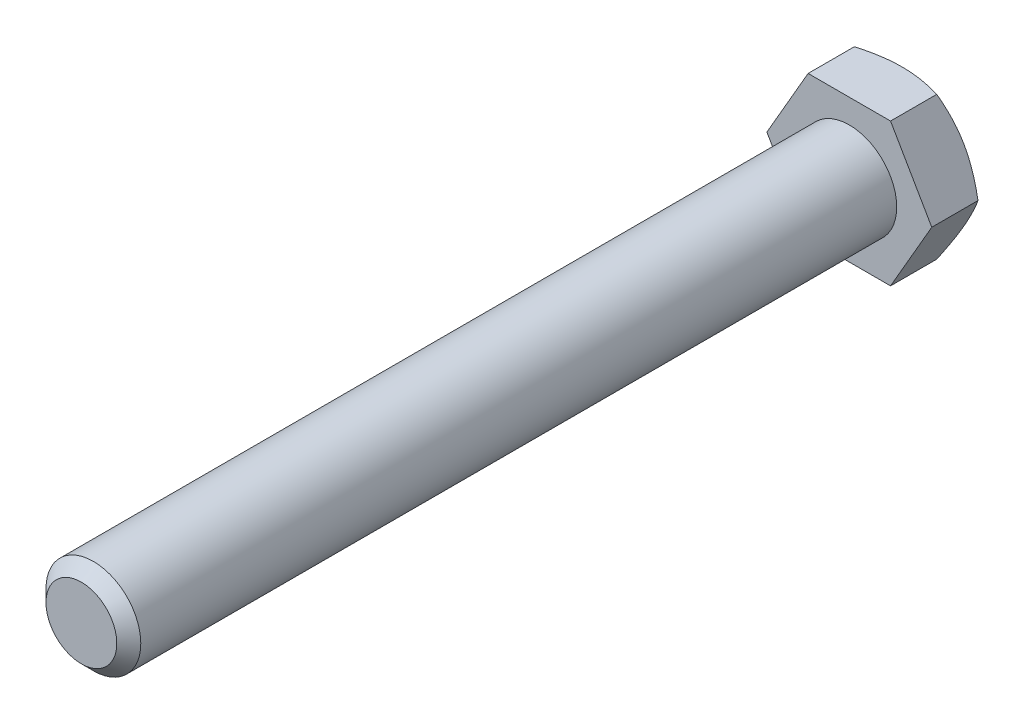
ISO-10303-21;
HEADER;
FILE_DESCRIPTION(('STEP AP214'),'2;1');
FILE_NAME('part.step','',(''),(''),'','','');
FILE_SCHEMA(('AUTOMOTIVE_DESIGN { 1 0 10303 214 1 1 1 1 }'));
ENDSEC;
DATA;
#1=APPLICATION_CONTEXT('core data for automotive mechanical design processes');
#2=APPLICATION_PROTOCOL_DEFINITION('international standard','automotive_design',2000,#1);
#3=PRODUCT_CONTEXT('',#1,'mechanical');
#4=PRODUCT('Part','Part','',(#3));
#5=PRODUCT_RELATED_PRODUCT_CATEGORY('part','',(#4));
#6=PRODUCT_DEFINITION_FORMATION('','',#4);
#7=PRODUCT_DEFINITION_CONTEXT('part definition',#1,'design');
#8=PRODUCT_DEFINITION('design','',#6,#7);
#9=PRODUCT_DEFINITION_SHAPE('','',#8);
#10=(LENGTH_UNIT() NAMED_UNIT(*) SI_UNIT(.MILLI.,.METRE.));
#11=(NAMED_UNIT(*) PLANE_ANGLE_UNIT() SI_UNIT($,.RADIAN.));
#12=(NAMED_UNIT(*) SI_UNIT($,.STERADIAN.) SOLID_ANGLE_UNIT());
#13=UNCERTAINTY_MEASURE_WITH_UNIT(LENGTH_MEASURE(1.E-05),#10,'distance_accuracy_value','');
#14=(GEOMETRIC_REPRESENTATION_CONTEXT(3) GLOBAL_UNCERTAINTY_ASSIGNED_CONTEXT((#13)) GLOBAL_UNIT_ASSIGNED_CONTEXT((#10,
#11,#12)) REPRESENTATION_CONTEXT('',''));
#15=CARTESIAN_POINT('',(0.,0.,0.));
#16=DIRECTION('',(0.,0.,1.));
#17=DIRECTION('',(1.,0.,0.));
#18=AXIS2_PLACEMENT_3D('',#15,#16,#17);
#19=CARTESIAN_POINT('',(-6.87046820335655,0.,0.));
#20=DIRECTION('',(0.,0.,1.));
#21=DIRECTION('',(1.,0.,0.));
#22=AXIS2_PLACEMENT_3D('',#19,#20,#21);
#23=PLANE('',#22);
#24=CARTESIAN_POINT('',(0.,0.,0.));
#25=DIRECTION('',(0.,0.,1.));
#26=DIRECTION('',(1.,0.,0.));
#27=AXIS2_PLACEMENT_3D('',#24,#25,#26);
#28=CIRCLE('',#27,5.75000000000001);
#29=CARTESIAN_POINT('',(5.75000000000001,0.,0.));
#30=VERTEX_POINT('',#29);
#31=EDGE_CURVE('E21',#30,#30,#28,.T.);
#32=ORIENTED_EDGE('',*,*,#31,.F.);
#33=EDGE_LOOP('',(#32));
#34=FACE_BOUND('',#33,.T.);
#35=ADVANCED_FACE('F18',(#34),#23,.F.);
#36=CARTESIAN_POINT('',(0.,0.,0.650784034539269));
#37=DIRECTION('',(0.,0.,1.));
#38=DIRECTION('',(1.,0.,0.));
#39=AXIS2_PLACEMENT_3D('',#36,#37,#38);
#40=CONICAL_SURFACE('',#39,6.8771910125767,1.0471975511966);
#41=ORIENTED_EDGE('',*,*,#31,.T.);
#42=EDGE_LOOP('',(#41));
#43=FACE_BOUND('',#42,.T.);
#44=CARTESIAN_POINT('',(-6.87046820335654,0.,0.646902618826299));
#45=CARTESIAN_POINT('',(-6.79495870568168,0.130786286426872,0.603315600492732));
#46=CARTESIAN_POINT('',(-6.71916767305091,0.262060205701468,0.561706886634503));
#47=CARTESIAN_POINT('',(-6.5669701138254,0.525674111068019,0.482990907622878));
#48=CARTESIAN_POINT('',(-6.49056333675953,0.658014530988701,0.445885584322402));
#49=CARTESIAN_POINT('',(-6.26011972368761,1.05715457710901,0.342053088782598));
#50=CARTESIAN_POINT('',(-6.10517327768795,1.32552969403265,0.282995277439475));
#51=CARTESIAN_POINT('',(-5.87329875913655,1.72714814114424,0.213744692153124));
#52=CARTESIAN_POINT('',(-5.79706343562102,1.85919159480459,0.194017533469075));
#53=CARTESIAN_POINT('',(-5.64424836941167,2.12387505364119,0.160938763141249));
#54=CARTESIAN_POINT('',(-5.5676686577517,2.25651500506524,0.147586588205554));
#55=CARTESIAN_POINT('',(-5.41437627553456,2.52202519947858,0.127598068405892));
#56=CARTESIAN_POINT('',(-5.33766385524756,2.65489500898724,0.120954102814179));
#57=CARTESIAN_POINT('',(-5.18417244162739,2.92074993590294,0.11451733148269));
#58=CARTESIAN_POINT('',(-5.10739345042496,3.05373504961945,0.114724314011353));
#59=CARTESIAN_POINT('',(-4.89705723311697,3.41804806466872,0.124707706897092));
#60=CARTESIAN_POINT('',(-4.76356889956949,3.64925664059066,0.141458760287246));
#61=CARTESIAN_POINT('',(-4.49747882662404,4.11013816632189,0.194570766058901));
#62=CARTESIAN_POINT('',(-4.36487802263779,4.33980949595056,0.230949862195485));
#63=CARTESIAN_POINT('',(-4.09825268712567,4.80161812364264,0.321884794411527));
#64=CARTESIAN_POINT('',(-3.96426178924513,5.03369716652351,0.376825814429518));
#65=CARTESIAN_POINT('',(-3.69827788307303,5.49439480600922,0.501518898713052));
#66=CARTESIAN_POINT('',(-3.56628146986192,5.72301930010771,0.571241683534182));
#67=CARTESIAN_POINT('',(-3.43523410167826,5.95,0.6469026188263));
#68=B_SPLINE_CURVE_WITH_KNOTS('',3,(#44,#45,#46,#47,#48,#49,#50,#51,#52,#53,#54,#55,#56,#57,#58,
#59,#60,#61,#62,#63,#64,#65,#66,#67),.UNSPECIFIED.,.F.,.F.,(4,2,2,2,2,2,2,2,2,2,2,4),(0.,
0.471512008193405,0.943226614464619,1.88861558573863,2.34973252633164,2.81080871520698,
3.27136051629853,3.73189808384768,4.53356209270655,5.33596841591502,6.15616826628045,
6.97475841058366),.UNSPECIFIED.);
#69=CARTESIAN_POINT('',(-6.87046820335654,0.,0.646902618826301));
#70=VERTEX_POINT('',#69);
#71=CARTESIAN_POINT('',(-3.43523410167826,5.95,0.646902618826301));
#72=VERTEX_POINT('',#71);
#73=EDGE_CURVE('E72',#70,#72,#68,.T.);
#74=ORIENTED_EDGE('',*,*,#73,.T.);
#75=CARTESIAN_POINT('',(3.43523410167829,5.95,0.646902618826309));
#76=CARTESIAN_POINT('',(3.28421510632857,5.95,0.603315600492742));
#77=CARTESIAN_POINT('',(3.13263304106704,5.95,0.561706886634513));
#78=CARTESIAN_POINT('',(2.82823792261602,5.95,0.482990907622887));
#79=CARTESIAN_POINT('',(2.67542436848427,5.95,0.44588558432241));
#80=CARTESIAN_POINT('',(2.21453714234043,5.95,0.342053088782605));
#81=CARTESIAN_POINT('',(1.9046442503411,5.95,0.282995277439482));
#82=CARTESIAN_POINT('',(1.44089521323832,5.95,0.21374469215313));
#83=CARTESIAN_POINT('',(1.28842456620725,5.95,0.194017533469081));
#84=CARTESIAN_POINT('',(0.982794433788545,5.95,0.160938763141255));
#85=CARTESIAN_POINT('',(0.829635010468604,5.95,0.147586588205559));
#86=CARTESIAN_POINT('',(0.523050246034334,5.95,0.127598068405897));
#87=CARTESIAN_POINT('',(0.369625405460339,5.95,0.120954102814184));
#88=CARTESIAN_POINT('',(0.0626425782199958,5.95,0.114517331482695));
#89=CARTESIAN_POINT('',(-0.0909154041848748,5.95,0.114724314011358));
#90=CARTESIAN_POINT('',(-0.511587838800844,5.95,0.124707706897096));
#91=CARTESIAN_POINT('',(-0.778564505895808,5.95,0.14145876028725));
#92=CARTESIAN_POINT('',(-1.3107446517867,5.95,0.194570766058904));
#93=CARTESIAN_POINT('',(-1.57594625975921,5.95,0.230949862195487));
#94=CARTESIAN_POINT('',(-2.10919693078345,5.95,0.321884794411528));
#95=CARTESIAN_POINT('',(-2.37717872654452,5.95,0.37682581442952));
#96=CARTESIAN_POINT('',(-2.90914653888872,5.95,0.501518898713053));
#97=CARTESIAN_POINT('',(-3.17313936531093,5.95,0.571241683534182));
#98=CARTESIAN_POINT('',(-3.43523410167826,5.95,0.6469026188263));
#99=B_SPLINE_CURVE_WITH_KNOTS('',3,(#75,#76,#77,#78,#79,#80,#81,#82,#83,#84,#85,#86,#87,#88,#89,
#90,#91,#92,#93,#94,#95,#96,#97,#98),.UNSPECIFIED.,.F.,.F.,(4,2,2,2,2,2,2,2,2,2,2,4),(0.,
0.471512008193406,0.943226614464622,1.88861558573863,2.34973252633164,2.81080871520699,
3.27136051629854,3.73189808384769,4.53356209270656,5.33596841591503,6.15616826628046,
6.97475841058368),.UNSPECIFIED.);
#100=CARTESIAN_POINT('',(3.43523410167829,5.95,0.646902618826309));
#101=VERTEX_POINT('',#100);
#102=EDGE_CURVE('E132',#101,#72,#99,.T.);
#103=ORIENTED_EDGE('',*,*,#102,.F.);
#104=CARTESIAN_POINT('',(6.87046820335656,0.,0.646902618826314));
#105=CARTESIAN_POINT('',(6.7949587056817,0.130786286426848,0.603315600492747));
#106=CARTESIAN_POINT('',(6.71916767305094,0.262060205701445,0.561706886634518));
#107=CARTESIAN_POINT('',(6.56697011382543,0.525674111067998,0.482990907622892));
#108=CARTESIAN_POINT('',(6.49056333675956,0.65801453098868,0.445885584322415));
#109=CARTESIAN_POINT('',(6.26011972368764,1.05715457710899,0.342053088782611));
#110=CARTESIAN_POINT('',(6.10517327768797,1.32552969403264,0.282995277439488));
#111=CARTESIAN_POINT('',(5.87329875913658,1.72714814114422,0.213744692153136));
#112=CARTESIAN_POINT('',(5.79706343562105,1.85919159480458,0.194017533469086));
#113=CARTESIAN_POINT('',(5.64424836941169,2.12387505364118,0.16093876314126));
#114=CARTESIAN_POINT('',(5.56766865775172,2.25651500506522,0.147586588205565));
#115=CARTESIAN_POINT('',(5.41437627553459,2.52202519947857,0.127598068405903));
#116=CARTESIAN_POINT('',(5.33766385524759,2.65489500898723,0.12095410281419));
#117=CARTESIAN_POINT('',(5.18417244162742,2.92074993590293,0.1145173314827));
#118=CARTESIAN_POINT('',(5.10739345042498,3.05373504961944,0.114724314011364));
#119=CARTESIAN_POINT('',(4.897057233117,3.41804806466871,0.124707706897103));
#120=CARTESIAN_POINT('',(4.76356889956952,3.64925664059066,0.141458760287257));
#121=CARTESIAN_POINT('',(4.49747882662407,4.11013816632188,0.194570766058911));
#122=CARTESIAN_POINT('',(4.36487802263782,4.33980949595055,0.230949862195494));
#123=CARTESIAN_POINT('',(4.0982526871257,4.80161812364264,0.321884794411535));
#124=CARTESIAN_POINT('',(3.96426178924516,5.0336971665235,0.376825814429527));
#125=CARTESIAN_POINT('',(3.69827788307306,5.49439480600922,0.501518898713061));
#126=CARTESIAN_POINT('',(3.56628146986195,5.72301930010771,0.571241683534191));
#127=CARTESIAN_POINT('',(3.43523410167829,5.95,0.646902618826309));
#128=B_SPLINE_CURVE_WITH_KNOTS('',3,(#104,#105,#106,#107,#108,#109,#110,#111,#112,#113,#114,
#115,#116,#117,#118,#119,#120,#121,#122,#123,#124,#125,#126,#127),.UNSPECIFIED.,.F.,.F.,(4,2,2,
2,2,2,2,2,2,2,2,4),(0.,0.471512008193407,0.943226614464624,1.88861558573863,2.34973252633165,
2.81080871520699,3.27136051629854,3.7318980838477,4.53356209270657,5.33596841591504,
6.15616826628047,6.97475841058369),.UNSPECIFIED.);
#129=CARTESIAN_POINT('',(6.87046820335656,0.,0.646902618826312));
#130=VERTEX_POINT('',#129);
#131=EDGE_CURVE('E139',#130,#101,#128,.T.);
#132=ORIENTED_EDGE('',*,*,#131,.F.);
#133=CARTESIAN_POINT('',(3.43523410167828,-5.95000000000001,0.646902618826309));
#134=CARTESIAN_POINT('',(3.51074359935314,-5.81921371357314,0.603315600492742));
#135=CARTESIAN_POINT('',(3.5865346319839,-5.68793979429855,0.561706886634513));
#136=CARTESIAN_POINT('',(3.73873219120941,-5.424325888932,0.482990907622888));
#137=CARTESIAN_POINT('',(3.81513896827529,-5.29198546901131,0.445885584322411));
#138=CARTESIAN_POINT('',(4.04558258134721,-4.892845422891,0.342053088782608));
#139=CARTESIAN_POINT('',(4.20052902734687,-4.62447030596736,0.282995277439486));
#140=CARTESIAN_POINT('',(4.43240354589827,-4.22285185885578,0.213744692153134));
#141=CARTESIAN_POINT('',(4.5086388694138,-4.09080840519542,0.194017533469085));
#142=CARTESIAN_POINT('',(4.66145393562315,-3.82612494635882,0.160938763141259));
#143=CARTESIAN_POINT('',(4.73803364728312,-3.69348499493477,0.147586588205564));
#144=CARTESIAN_POINT('',(4.89132602950026,-3.42797480052143,0.127598068405903));
#145=CARTESIAN_POINT('',(4.96803844978726,-3.29510499101277,0.12095410281419));
#146=CARTESIAN_POINT('',(5.12152986340743,-3.02925006409706,0.114517331482701));
#147=CARTESIAN_POINT('',(5.19830885460986,-2.89626495038056,0.114724314011365));
#148=CARTESIAN_POINT('',(5.40864507191785,-2.53195193533129,0.124707706897104));
#149=CARTESIAN_POINT('',(5.54213340546533,-2.30074335940935,0.141458760287258));
#150=CARTESIAN_POINT('',(5.80822347841078,-1.83986183367813,0.194570766058912));
#151=CARTESIAN_POINT('',(5.94082428239703,-1.61019050404946,0.230949862195496));
#152=CARTESIAN_POINT('',(6.20744961790915,-1.14838187635737,0.321884794411537));
#153=CARTESIAN_POINT('',(6.34144051578969,-0.916302833476506,0.376825814429529));
#154=CARTESIAN_POINT('',(6.60742442196179,-0.455605193990791,0.501518898713062));
#155=CARTESIAN_POINT('',(6.73942083517289,-0.226980699892305,0.571241683534192));
#156=CARTESIAN_POINT('',(6.87046820335656,0.,0.64690261882631));
#157=B_SPLINE_CURVE_WITH_KNOTS('',3,(#133,#134,#135,#136,#137,#138,#139,#140,#141,#142,#143,
#144,#145,#146,#147,#148,#149,#150,#151,#152,#153,#154,#155,#156),.UNSPECIFIED.,.F.,.F.,(4,2,2,
2,2,2,2,2,2,2,2,4),(0.,0.471512008193406,0.943226614464623,1.88861558573863,2.34973252633165,
2.81080871520699,3.27136051629854,3.73189808384769,4.53356209270656,5.33596841591503,
6.15616826628045,6.97475841058367),.UNSPECIFIED.);
#158=CARTESIAN_POINT('',(3.43523410167827,-5.95,0.646902618826306));
#159=VERTEX_POINT('',#158);
#160=EDGE_CURVE('E162',#159,#130,#157,.T.);
#161=ORIENTED_EDGE('',*,*,#160,.F.);
#162=CARTESIAN_POINT('',(-3.43523410167828,-5.95,0.646902618826306));
#163=CARTESIAN_POINT('',(-3.28421510632856,-5.95,0.603315600492739));
#164=CARTESIAN_POINT('',(-3.13263304106703,-5.95,0.56170688663451));
#165=CARTESIAN_POINT('',(-2.82823792261601,-5.95,0.482990907622884));
#166=CARTESIAN_POINT('',(-2.67542436848426,-5.95,0.445885584322408));
#167=CARTESIAN_POINT('',(-2.21453714234042,-5.95,0.342053088782604));
#168=CARTESIAN_POINT('',(-1.9046442503411,-5.95,0.282995277439481));
#169=CARTESIAN_POINT('',(-1.44089521323831,-5.95,0.213744692153129));
#170=CARTESIAN_POINT('',(-1.28842456620724,-5.95,0.19401753346908));
#171=CARTESIAN_POINT('',(-0.982794433788536,-5.95,0.160938763141254));
#172=CARTESIAN_POINT('',(-0.829635010468596,-5.95,0.147586588205559));
#173=CARTESIAN_POINT('',(-0.523050246034326,-5.95,0.127598068405897));
#174=CARTESIAN_POINT('',(-0.369625405460331,-5.95,0.120954102814184));
#175=CARTESIAN_POINT('',(-0.0626425782199882,-5.95,0.114517331482694));
#176=CARTESIAN_POINT('',(0.0909154041848823,-5.95,0.114724314011358));
#177=CARTESIAN_POINT('',(0.511587838800852,-5.95,0.124707706897096));
#178=CARTESIAN_POINT('',(0.778564505895815,-5.95,0.141458760287251));
#179=CARTESIAN_POINT('',(1.31074465178671,-5.95,0.194570766058905));
#180=CARTESIAN_POINT('',(1.57594625975921,-5.95,0.230949862195489));
#181=CARTESIAN_POINT('',(2.10919693078346,-5.95,0.32188479441153));
#182=CARTESIAN_POINT('',(2.37717872654453,-5.95,0.376825814429521));
#183=CARTESIAN_POINT('',(2.90914653888873,-5.95,0.501518898713055));
#184=CARTESIAN_POINT('',(3.17313936531094,-5.95,0.571241683534185));
#185=CARTESIAN_POINT('',(3.43523410167827,-5.95,0.646902618826304));
#186=B_SPLINE_CURVE_WITH_KNOTS('',3,(#162,#163,#164,#165,#166,#167,#168,#169,#170,#171,#172,
#173,#174,#175,#176,#177,#178,#179,#180,#181,#182,#183,#184,#185),.UNSPECIFIED.,.F.,.F.,(4,2,2,
2,2,2,2,2,2,2,2,4),(0.,0.471512008193406,0.943226614464622,1.88861558573863,2.34973252633164,
2.81080871520698,3.27136051629853,3.73189808384769,4.53356209270656,5.33596841591503,
6.15616826628045,6.97475841058367),.UNSPECIFIED.);
#187=CARTESIAN_POINT('',(-3.43523410167828,-5.95,0.646902618826305));
#188=VERTEX_POINT('',#187);
#189=EDGE_CURVE('E75',#188,#159,#186,.T.);
#190=ORIENTED_EDGE('',*,*,#189,.F.);
#191=CARTESIAN_POINT('',(-3.43523410167827,-5.95,0.646902618826303));
#192=CARTESIAN_POINT('',(-3.51074359935313,-5.81921371357313,0.603315600492736));
#193=CARTESIAN_POINT('',(-3.5865346319839,-5.68793979429854,0.561706886634507));
#194=CARTESIAN_POINT('',(-3.73873219120941,-5.42432588893199,0.482990907622882));
#195=CARTESIAN_POINT('',(-3.81513896827528,-5.29198546901131,0.445885584322405));
#196=CARTESIAN_POINT('',(-4.0455825813472,-4.892845422891,0.342053088782601));
#197=CARTESIAN_POINT('',(-4.20052902734686,-4.62447030596735,0.282995277439478));
#198=CARTESIAN_POINT('',(-4.43240354589826,-4.22285185885577,0.213744692153127));
#199=CARTESIAN_POINT('',(-4.50863886941379,-4.09080840519541,0.194017533469078));
#200=CARTESIAN_POINT('',(-4.66145393562314,-3.82612494635881,0.160938763141252));
#201=CARTESIAN_POINT('',(-4.73803364728311,-3.69348499493477,0.147586588205556));
#202=CARTESIAN_POINT('',(-4.89132602950025,-3.42797480052142,0.127598068405894));
#203=CARTESIAN_POINT('',(-4.96803844978724,-3.29510499101276,0.120954102814181));
#204=CARTESIAN_POINT('',(-5.12152986340742,-3.02925006409706,0.114517331482692));
#205=CARTESIAN_POINT('',(-5.19830885460985,-2.89626495038055,0.114724314011355));
#206=CARTESIAN_POINT('',(-5.40864507191784,-2.53195193533128,0.124707706897094));
#207=CARTESIAN_POINT('',(-5.54213340546532,-2.30074335940934,0.141458760287248));
#208=CARTESIAN_POINT('',(-5.80822347841076,-1.83986183367811,0.194570766058902));
#209=CARTESIAN_POINT('',(-5.94082428239702,-1.61019050404944,0.230949862195486));
#210=CARTESIAN_POINT('',(-6.20744961790914,-1.14838187635735,0.321884794411528));
#211=CARTESIAN_POINT('',(-6.34144051578967,-0.916302833476486,0.37682581442952));
#212=CARTESIAN_POINT('',(-6.60742442196178,-0.455605193990769,0.501518898713054));
#213=CARTESIAN_POINT('',(-6.73942083517288,-0.226980699892281,0.571241683534184));
#214=CARTESIAN_POINT('',(-6.87046820335654,0.,0.646902618826302));
#215=B_SPLINE_CURVE_WITH_KNOTS('',3,(#191,#192,#193,#194,#195,#196,#197,#198,#199,#200,#201,
#202,#203,#204,#205,#206,#207,#208,#209,#210,#211,#212,#213,#214),.UNSPECIFIED.,.F.,.F.,(4,2,2,
2,2,2,2,2,2,2,2,4),(0.,0.471512008193404,0.94322661446462,1.88861558573863,2.34973252633164,
2.81080871520698,3.27136051629853,3.73189808384769,4.53356209270656,5.33596841591503,
6.15616826628046,6.97475841058368),.UNSPECIFIED.);
#216=EDGE_CURVE('E69',#188,#70,#215,.T.);
#217=ORIENTED_EDGE('',*,*,#216,.T.);
#218=EDGE_LOOP('',(#74,#103,#132,#161,#190,#217));
#219=FACE_BOUND('',#218,.T.);
#220=ADVANCED_FACE('F71',(#43,#219),#40,.T.);
#221=CARTESIAN_POINT('',(-3.43523410167826,5.95,4.5));
#222=DIRECTION('',(0.866025403784438,-0.500000000000001,0.));
#223=DIRECTION('',(0.500000000000001,0.866025403784438,0.));
#224=AXIS2_PLACEMENT_3D('',#221,#222,#223);
#225=PLANE('',#224);
#226=ORIENTED_EDGE('',*,*,#73,.F.);
#227=DIRECTION('',(0.,0.,1.));
#228=VECTOR('',#227,1.);
#229=CARTESIAN_POINT('',(-6.87046820335654,0.,4.5));
#230=LINE('',#229,#228);
#231=CARTESIAN_POINT('',(-6.87046820335655,0.,4.5));
#232=VERTEX_POINT('',#231);
#233=EDGE_CURVE('E79',#70,#232,#230,.T.);
#234=ORIENTED_EDGE('',*,*,#233,.T.);
#235=DIRECTION('',(-0.500000000000003,-0.866025403784437,0.));
#236=VECTOR('',#235,1.);
#237=CARTESIAN_POINT('',(-3.43523410167826,5.95,4.5));
#238=LINE('',#237,#236);
#239=CARTESIAN_POINT('',(-3.43523410167826,5.95,4.5));
#240=VERTEX_POINT('',#239);
#241=EDGE_CURVE('E112',#240,#232,#238,.T.);
#242=ORIENTED_EDGE('',*,*,#241,.F.);
#243=DIRECTION('',(0.,0.,1.));
#244=VECTOR('',#243,1.);
#245=CARTESIAN_POINT('',(-3.43523410167826,5.95,4.5));
#246=LINE('',#245,#244);
#247=EDGE_CURVE('E85',#72,#240,#246,.T.);
#248=ORIENTED_EDGE('',*,*,#247,.F.);
#249=EDGE_LOOP('',(#226,#234,#242,#248));
#250=FACE_BOUND('',#249,.T.);
#251=ADVANCED_FACE('F82',(#250),#225,.F.);
#252=CARTESIAN_POINT('',(-6.87046820335655,0.,4.5));
#253=DIRECTION('',(0.866025403784439,0.499999999999999,0.));
#254=DIRECTION('',(-0.499999999999999,0.866025403784439,0.));
#255=AXIS2_PLACEMENT_3D('',#252,#253,#254);
#256=PLANE('',#255);
#257=ORIENTED_EDGE('',*,*,#216,.F.);
#258=DIRECTION('',(0.,0.,-1.));
#259=VECTOR('',#258,1.);
#260=CARTESIAN_POINT('',(-3.43523410167829,-5.95,4.5));
#261=LINE('',#260,#259);
#262=CARTESIAN_POINT('',(-3.43523410167829,-5.95,4.5));
#263=VERTEX_POINT('',#262);
#264=EDGE_CURVE('E92',#263,#188,#261,.T.);
#265=ORIENTED_EDGE('',*,*,#264,.F.);
#266=DIRECTION('',(0.499999999999997,-0.86602540378444,0.));
#267=VECTOR('',#266,1.);
#268=CARTESIAN_POINT('',(-6.87046820335655,0.,4.5));
#269=LINE('',#268,#267);
#270=EDGE_CURVE('E89',#232,#263,#269,.T.);
#271=ORIENTED_EDGE('',*,*,#270,.F.);
#272=ORIENTED_EDGE('',*,*,#233,.F.);
#273=EDGE_LOOP('',(#257,#265,#271,#272));
#274=FACE_BOUND('',#273,.T.);
#275=ADVANCED_FACE('F87',(#274),#256,.F.);
#276=CARTESIAN_POINT('',(3.43523410167826,-5.95,4.5));
#277=DIRECTION('',(0.,-1.,0.));
#278=DIRECTION('',(0.,0.,-1.));
#279=AXIS2_PLACEMENT_3D('',#276,#277,#278);
#280=PLANE('',#279);
#281=DIRECTION('',(1.,0.,0.));
#282=VECTOR('',#281,1.);
#283=CARTESIAN_POINT('',(-6.87046820335655,-5.95,4.5));
#284=LINE('',#283,#282);
#285=CARTESIAN_POINT('',(3.43523410167827,-5.95,4.5));
#286=VERTEX_POINT('',#285);
#287=EDGE_CURVE('E118',#263,#286,#284,.T.);
#288=ORIENTED_EDGE('',*,*,#287,.F.);
#289=ORIENTED_EDGE('',*,*,#264,.T.);
#290=ORIENTED_EDGE('',*,*,#189,.T.);
#291=DIRECTION('',(0.,0.,1.));
#292=VECTOR('',#291,1.);
#293=CARTESIAN_POINT('',(3.43523410167828,-5.95000000000001,4.5));
#294=LINE('',#293,#292);
#295=EDGE_CURVE('E221',#286,#159,#294,.F.);
#296=ORIENTED_EDGE('',*,*,#295,.F.);
#297=EDGE_LOOP('',(#288,#289,#290,#296));
#298=FACE_BOUND('',#297,.T.);
#299=ADVANCED_FACE('F174',(#298),#280,.T.);
#300=CARTESIAN_POINT('',(6.87046820335655,0.,4.5));
#301=DIRECTION('',(0.866025403784438,-0.500000000000001,0.));
#302=DIRECTION('',(0.500000000000001,0.866025403784438,0.));
#303=AXIS2_PLACEMENT_3D('',#300,#301,#302);
#304=PLANE('',#303);
#305=DIRECTION('',(0.500000000000004,0.866025403784437,0.));
#306=VECTOR('',#305,1.);
#307=CARTESIAN_POINT('',(3.43523410167826,-5.95,4.5));
#308=LINE('',#307,#306);
#309=CARTESIAN_POINT('',(6.87046820335656,0.,4.5));
#310=VERTEX_POINT('',#309);
#311=EDGE_CURVE('E109',#286,#310,#308,.T.);
#312=ORIENTED_EDGE('',*,*,#311,.F.);
#313=ORIENTED_EDGE('',*,*,#295,.T.);
#314=ORIENTED_EDGE('',*,*,#160,.T.);
#315=DIRECTION('',(0.,0.,1.));
#316=VECTOR('',#315,1.);
#317=CARTESIAN_POINT('',(6.87046820335657,0.,4.5));
#318=LINE('',#317,#316);
#319=EDGE_CURVE('E138',#310,#130,#318,.F.);
#320=ORIENTED_EDGE('',*,*,#319,.F.);
#321=EDGE_LOOP('',(#312,#313,#314,#320));
#322=FACE_BOUND('',#321,.T.);
#323=ADVANCED_FACE('F177',(#322),#304,.T.);
#324=CARTESIAN_POINT('',(3.43523410167829,5.95,4.5));
#325=DIRECTION('',(0.866025403784439,0.499999999999999,0.));
#326=DIRECTION('',(-0.499999999999999,0.866025403784439,0.));
#327=AXIS2_PLACEMENT_3D('',#324,#325,#326);
#328=PLANE('',#327);
#329=DIRECTION('',(-0.499999999999997,0.86602540378444,0.));
#330=VECTOR('',#329,1.);
#331=CARTESIAN_POINT('',(6.87046820335655,0.,4.5));
#332=LINE('',#331,#330);
#333=CARTESIAN_POINT('',(3.43523410167829,5.95,4.5));
#334=VERTEX_POINT('',#333);
#335=EDGE_CURVE('E104',#310,#334,#332,.T.);
#336=ORIENTED_EDGE('',*,*,#335,.F.);
#337=ORIENTED_EDGE('',*,*,#319,.T.);
#338=ORIENTED_EDGE('',*,*,#131,.T.);
#339=DIRECTION('',(0.,0.,1.));
#340=VECTOR('',#339,1.);
#341=CARTESIAN_POINT('',(3.43523410167829,5.95,4.5));
#342=LINE('',#341,#340);
#343=EDGE_CURVE('E36',#334,#101,#342,.F.);
#344=ORIENTED_EDGE('',*,*,#343,.F.);
#345=EDGE_LOOP('',(#336,#337,#338,#344));
#346=FACE_BOUND('',#345,.T.);
#347=ADVANCED_FACE('F207',(#346),#328,.T.);
#348=CARTESIAN_POINT('',(-3.43523410167826,5.95,4.5));
#349=DIRECTION('',(0.,1.,0.));
#350=DIRECTION('',(0.,0.,1.));
#351=AXIS2_PLACEMENT_3D('',#348,#349,#350);
#352=PLANE('',#351);
#353=DIRECTION('',(1.,0.,0.));
#354=VECTOR('',#353,1.);
#355=CARTESIAN_POINT('',(-6.87046820335655,5.95,4.5));
#356=LINE('',#355,#354);
#357=EDGE_CURVE('E100',#334,#240,#356,.F.);
#358=ORIENTED_EDGE('',*,*,#357,.F.);
#359=ORIENTED_EDGE('',*,*,#343,.T.);
#360=ORIENTED_EDGE('',*,*,#102,.T.);
#361=ORIENTED_EDGE('',*,*,#247,.T.);
#362=EDGE_LOOP('',(#358,#359,#360,#361));
#363=FACE_BOUND('',#362,.T.);
#364=ADVANCED_FACE('F145',(#363),#352,.T.);
#365=CARTESIAN_POINT('',(0.,0.,68.5));
#366=DIRECTION('',(0.,0.,1.));
#367=DIRECTION('',(1.,0.,0.));
#368=AXIS2_PLACEMENT_3D('',#365,#366,#367);
#369=PLANE('',#368);
#370=CARTESIAN_POINT('',(0.,0.,68.4999999999718));
#371=DIRECTION('',(0.,0.,-1.));
#372=DIRECTION('',(-1.,0.,0.));
#373=AXIS2_PLACEMENT_3D('',#370,#371,#372);
#374=CIRCLE('',#373,2.94999999999845);
#375=CARTESIAN_POINT('',(-2.94999999999845,0.,68.4999999999718));
#376=VERTEX_POINT('',#375);
#377=EDGE_CURVE('E103',#376,#376,#374,.T.);
#378=ORIENTED_EDGE('',*,*,#377,.F.);
#379=EDGE_LOOP('',(#378));
#380=FACE_BOUND('',#379,.T.);
#381=ADVANCED_FACE('F200',(#380),#369,.T.);
#382=CARTESIAN_POINT('',(-6.87046820335655,0.,4.5));
#383=DIRECTION('',(0.,0.,1.));
#384=DIRECTION('',(1.,0.,0.));
#385=AXIS2_PLACEMENT_3D('',#382,#383,#384);
#386=PLANE('',#385);
#387=CARTESIAN_POINT('',(0.,0.,4.5));
#388=DIRECTION('',(0.,0.,1.));
#389=DIRECTION('',(1.,0.,0.));
#390=AXIS2_PLACEMENT_3D('',#387,#388,#389);
#391=CIRCLE('',#390,3.95);
#392=CARTESIAN_POINT('',(3.95,0.,4.5));
#393=VERTEX_POINT('',#392);
#394=EDGE_CURVE('E27',#393,#393,#391,.T.);
#395=ORIENTED_EDGE('',*,*,#394,.F.);
#396=EDGE_LOOP('',(#395));
#397=FACE_BOUND('',#396,.T.);
#398=ORIENTED_EDGE('',*,*,#335,.T.);
#399=ORIENTED_EDGE('',*,*,#357,.T.);
#400=ORIENTED_EDGE('',*,*,#241,.T.);
#401=ORIENTED_EDGE('',*,*,#270,.T.);
#402=ORIENTED_EDGE('',*,*,#287,.T.);
#403=ORIENTED_EDGE('',*,*,#311,.T.);
#404=EDGE_LOOP('',(#398,#399,#400,#401,#402,#403));
#405=FACE_BOUND('',#404,.T.);
#406=ADVANCED_FACE('F194',(#397,#405),#386,.T.);
#407=CARTESIAN_POINT('',(0.,0.,67.4999999998818));
#408=DIRECTION('',(0.,0.,-1.));
#409=DIRECTION('',(-1.,0.,0.));
#410=AXIS2_PLACEMENT_3D('',#407,#408,#409);
#411=CONICAL_SURFACE('',#410,3.95000000008849,0.785398163397448);
#412=ORIENTED_EDGE('',*,*,#377,.T.);
#413=EDGE_LOOP('',(#412));
#414=FACE_BOUND('',#413,.T.);
#415=CARTESIAN_POINT('',(0.,0.,67.5));
#416=DIRECTION('',(0.,0.,1.));
#417=DIRECTION('',(1.,0.,0.));
#418=AXIS2_PLACEMENT_3D('',#415,#416,#417);
#419=CIRCLE('',#418,3.95);
#420=CARTESIAN_POINT('',(3.95,0.,67.5));
#421=VERTEX_POINT('',#420);
#422=EDGE_CURVE('E11',#421,#421,#419,.F.);
#423=ORIENTED_EDGE('',*,*,#422,.F.);
#424=EDGE_LOOP('',(#423));
#425=FACE_BOUND('',#424,.T.);
#426=ADVANCED_FACE('F188',(#414,#425),#411,.T.);
#427=CARTESIAN_POINT('',(0.,0.,68.5));
#428=DIRECTION('',(0.,0.,1.));
#429=DIRECTION('',(1.,0.,0.));
#430=AXIS2_PLACEMENT_3D('',#427,#428,#429);
#431=CYLINDRICAL_SURFACE('',#430,3.95);
#432=ORIENTED_EDGE('',*,*,#422,.T.);
#433=EDGE_LOOP('',(#432));
#434=FACE_BOUND('',#433,.T.);
#435=ORIENTED_EDGE('',*,*,#394,.T.);
#436=EDGE_LOOP('',(#435));
#437=FACE_BOUND('',#436,.T.);
#438=ADVANCED_FACE('F186',(#434,#437),#431,.T.);
#439=CLOSED_SHELL('',(#35,#220,#251,#275,#299,#323,#347,#364,#381,#406,#426,#438));
#440=MANIFOLD_SOLID_BREP('B1',#439);
#441=ADVANCED_BREP_SHAPE_REPRESENTATION('',(#18,#440),#14);
#442=SHAPE_DEFINITION_REPRESENTATION(#9,#441);
ENDSEC;
END-ISO-10303-21;
